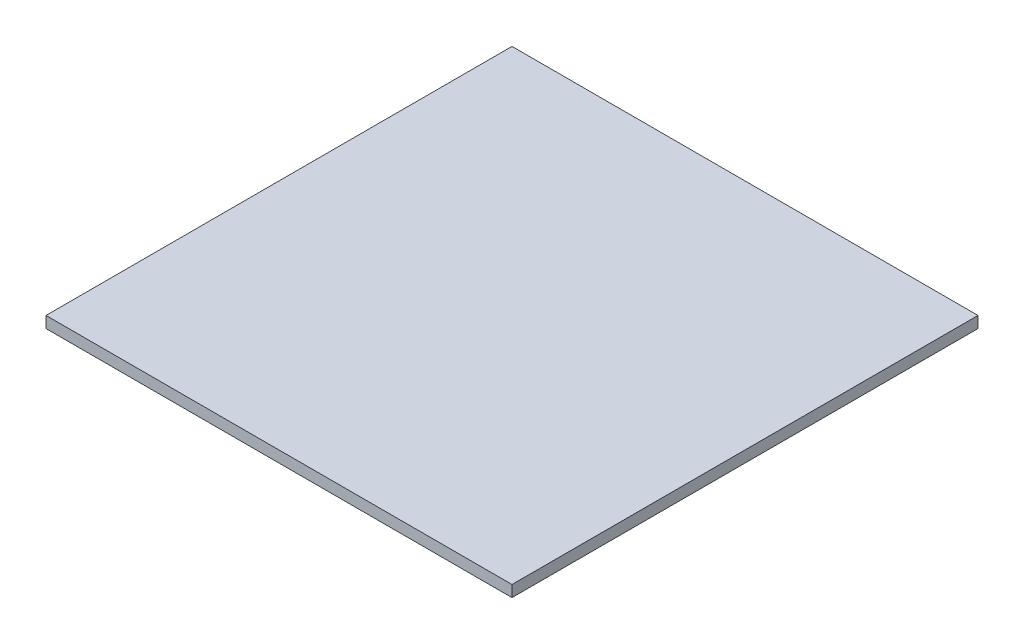
ISO-10303-21;
HEADER;
FILE_DESCRIPTION(('STEP AP214'),'2;1');
FILE_NAME('part.step','',(''),(''),'','','');
FILE_SCHEMA(('AUTOMOTIVE_DESIGN { 1 0 10303 214 1 1 1 1 }'));
ENDSEC;
DATA;
#1=APPLICATION_CONTEXT('core data for automotive mechanical design processes');
#2=APPLICATION_PROTOCOL_DEFINITION('international standard','automotive_design',2000,#1);
#3=PRODUCT_CONTEXT('',#1,'mechanical');
#4=PRODUCT('Part','Part','',(#3));
#5=PRODUCT_RELATED_PRODUCT_CATEGORY('part','',(#4));
#6=PRODUCT_DEFINITION_FORMATION('','',#4);
#7=PRODUCT_DEFINITION_CONTEXT('part definition',#1,'design');
#8=PRODUCT_DEFINITION('design','',#6,#7);
#9=PRODUCT_DEFINITION_SHAPE('','',#8);
#10=(LENGTH_UNIT() NAMED_UNIT(*) SI_UNIT(.MILLI.,.METRE.));
#11=(NAMED_UNIT(*) PLANE_ANGLE_UNIT() SI_UNIT($,.RADIAN.));
#12=(NAMED_UNIT(*) SI_UNIT($,.STERADIAN.) SOLID_ANGLE_UNIT());
#13=UNCERTAINTY_MEASURE_WITH_UNIT(LENGTH_MEASURE(1.E-05),#10,'distance_accuracy_value','');
#14=(GEOMETRIC_REPRESENTATION_CONTEXT(3) GLOBAL_UNCERTAINTY_ASSIGNED_CONTEXT((#13)) GLOBAL_UNIT_ASSIGNED_CONTEXT((#10,
#11,#12)) REPRESENTATION_CONTEXT('',''));
#15=CARTESIAN_POINT('',(0.,0.,0.));
#16=DIRECTION('',(0.,0.,1.));
#17=DIRECTION('',(1.,0.,0.));
#18=AXIS2_PLACEMENT_3D('',#15,#16,#17);
#19=CARTESIAN_POINT('',(520.7,25.4,-520.7));
#20=DIRECTION('',(-1.,0.,0.));
#21=DIRECTION('',(0.,0.,1.));
#22=AXIS2_PLACEMENT_3D('',#19,#20,#21);
#23=PLANE('',#22);
#24=DIRECTION('',(0.,0.,-1.));
#25=VECTOR('',#24,1.);
#26=CARTESIAN_POINT('',(520.7,0.,-520.7));
#27=LINE('',#26,#25);
#28=CARTESIAN_POINT('',(520.7,0.,520.7));
#29=VERTEX_POINT('',#28);
#30=CARTESIAN_POINT('',(520.7,0.,-520.7));
#31=VERTEX_POINT('',#30);
#32=EDGE_CURVE('E110',#29,#31,#27,.T.);
#33=ORIENTED_EDGE('',*,*,#32,.T.);
#34=DIRECTION('',(0.,-1.,0.));
#35=VECTOR('',#34,1.);
#36=CARTESIAN_POINT('',(520.7,25.4,-520.7));
#37=LINE('',#36,#35);
#38=CARTESIAN_POINT('',(520.7,25.4,-520.7));
#39=VERTEX_POINT('',#38);
#40=EDGE_CURVE('E11',#39,#31,#37,.T.);
#41=ORIENTED_EDGE('',*,*,#40,.F.);
#42=DIRECTION('',(0.,0.,-1.));
#43=VECTOR('',#42,1.);
#44=CARTESIAN_POINT('',(520.7,25.4,-520.7));
#45=LINE('',#44,#43);
#46=CARTESIAN_POINT('',(520.7,25.4,520.7));
#47=VERTEX_POINT('',#46);
#48=EDGE_CURVE('E98',#47,#39,#45,.T.);
#49=ORIENTED_EDGE('',*,*,#48,.F.);
#50=DIRECTION('',(0.,-1.,0.));
#51=VECTOR('',#50,1.);
#52=CARTESIAN_POINT('',(520.7,25.4,520.7));
#53=LINE('',#52,#51);
#54=EDGE_CURVE('E106',#47,#29,#53,.T.);
#55=ORIENTED_EDGE('',*,*,#54,.T.);
#56=EDGE_LOOP('',(#33,#41,#49,#55));
#57=FACE_BOUND('',#56,.T.);
#58=ADVANCED_FACE('F47',(#57),#23,.F.);
#59=CARTESIAN_POINT('',(-520.7,25.4,-520.7));
#60=DIRECTION('',(0.,0.,1.));
#61=DIRECTION('',(1.,0.,0.));
#62=AXIS2_PLACEMENT_3D('',#59,#60,#61);
#63=PLANE('',#62);
#64=DIRECTION('',(-1.,0.,0.));
#65=VECTOR('',#64,1.);
#66=CARTESIAN_POINT('',(-520.7,0.,-520.7));
#67=LINE('',#66,#65);
#68=CARTESIAN_POINT('',(-520.7,0.,-520.7));
#69=VERTEX_POINT('',#68);
#70=EDGE_CURVE('E102',#31,#69,#67,.T.);
#71=ORIENTED_EDGE('',*,*,#70,.T.);
#72=DIRECTION('',(0.,-1.,0.));
#73=VECTOR('',#72,1.);
#74=CARTESIAN_POINT('',(-520.7,25.4,-520.7));
#75=LINE('',#74,#73);
#76=CARTESIAN_POINT('',(-520.7,25.4,-520.7));
#77=VERTEX_POINT('',#76);
#78=EDGE_CURVE('E55',#77,#69,#75,.T.);
#79=ORIENTED_EDGE('',*,*,#78,.F.);
#80=DIRECTION('',(-1.,0.,0.));
#81=VECTOR('',#80,1.);
#82=CARTESIAN_POINT('',(-520.7,25.4,-520.7));
#83=LINE('',#82,#81);
#84=EDGE_CURVE('E93',#39,#77,#83,.T.);
#85=ORIENTED_EDGE('',*,*,#84,.F.);
#86=ORIENTED_EDGE('',*,*,#40,.T.);
#87=EDGE_LOOP('',(#71,#79,#85,#86));
#88=FACE_BOUND('',#87,.T.);
#89=ADVANCED_FACE('F101',(#88),#63,.F.);
#90=CARTESIAN_POINT('',(-520.7,25.4,-520.7));
#91=DIRECTION('',(1.,0.,0.));
#92=DIRECTION('',(0.,0.,-1.));
#93=AXIS2_PLACEMENT_3D('',#90,#91,#92);
#94=PLANE('',#93);
#95=DIRECTION('',(0.,0.,1.));
#96=VECTOR('',#95,1.);
#97=CARTESIAN_POINT('',(-520.7,0.,-520.7));
#98=LINE('',#97,#96);
#99=CARTESIAN_POINT('',(-520.7,0.,520.7));
#100=VERTEX_POINT('',#99);
#101=EDGE_CURVE('E80',#69,#100,#98,.T.);
#102=ORIENTED_EDGE('',*,*,#101,.T.);
#103=DIRECTION('',(0.,-1.,0.));
#104=VECTOR('',#103,1.);
#105=CARTESIAN_POINT('',(-520.7,25.4,520.7));
#106=LINE('',#105,#104);
#107=CARTESIAN_POINT('',(-520.7,25.4,520.7));
#108=VERTEX_POINT('',#107);
#109=EDGE_CURVE('E103',#108,#100,#106,.T.);
#110=ORIENTED_EDGE('',*,*,#109,.F.);
#111=DIRECTION('',(0.,0.,1.));
#112=VECTOR('',#111,1.);
#113=CARTESIAN_POINT('',(-520.7,25.4,-520.7));
#114=LINE('',#113,#112);
#115=EDGE_CURVE('E96',#77,#108,#114,.T.);
#116=ORIENTED_EDGE('',*,*,#115,.F.);
#117=ORIENTED_EDGE('',*,*,#78,.T.);
#118=EDGE_LOOP('',(#102,#110,#116,#117));
#119=FACE_BOUND('',#118,.T.);
#120=ADVANCED_FACE('F104',(#119),#94,.F.);
#121=CARTESIAN_POINT('',(-520.7,25.4,520.7));
#122=DIRECTION('',(0.,0.,-1.));
#123=DIRECTION('',(-1.,0.,0.));
#124=AXIS2_PLACEMENT_3D('',#121,#122,#123);
#125=PLANE('',#124);
#126=DIRECTION('',(1.,0.,0.));
#127=VECTOR('',#126,1.);
#128=CARTESIAN_POINT('',(-520.7,0.,520.7));
#129=LINE('',#128,#127);
#130=EDGE_CURVE('E86',#100,#29,#129,.T.);
#131=ORIENTED_EDGE('',*,*,#130,.T.);
#132=ORIENTED_EDGE('',*,*,#54,.F.);
#133=DIRECTION('',(1.,0.,0.));
#134=VECTOR('',#133,1.);
#135=CARTESIAN_POINT('',(-520.7,25.4,520.7));
#136=LINE('',#135,#134);
#137=EDGE_CURVE('E63',#108,#47,#136,.T.);
#138=ORIENTED_EDGE('',*,*,#137,.F.);
#139=ORIENTED_EDGE('',*,*,#109,.T.);
#140=EDGE_LOOP('',(#131,#132,#138,#139));
#141=FACE_BOUND('',#140,.T.);
#142=ADVANCED_FACE('F117',(#141),#125,.F.);
#143=CARTESIAN_POINT('',(0.,25.4,0.));
#144=DIRECTION('',(0.,1.,0.));
#145=DIRECTION('',(0.,0.,1.));
#146=AXIS2_PLACEMENT_3D('',#143,#144,#145);
#147=PLANE('',#146);
#148=ORIENTED_EDGE('',*,*,#48,.T.);
#149=ORIENTED_EDGE('',*,*,#84,.T.);
#150=ORIENTED_EDGE('',*,*,#115,.T.);
#151=ORIENTED_EDGE('',*,*,#137,.T.);
#152=EDGE_LOOP('',(#148,#149,#150,#151));
#153=FACE_BOUND('',#152,.T.);
#154=ADVANCED_FACE('F94',(#153),#147,.T.);
#155=CARTESIAN_POINT('',(0.,0.,0.));
#156=DIRECTION('',(0.,1.,0.));
#157=DIRECTION('',(0.,0.,1.));
#158=AXIS2_PLACEMENT_3D('',#155,#156,#157);
#159=PLANE('',#158);
#160=ORIENTED_EDGE('',*,*,#32,.F.);
#161=ORIENTED_EDGE('',*,*,#130,.F.);
#162=ORIENTED_EDGE('',*,*,#101,.F.);
#163=ORIENTED_EDGE('',*,*,#70,.F.);
#164=EDGE_LOOP('',(#160,#161,#162,#163));
#165=FACE_BOUND('',#164,.T.);
#166=ADVANCED_FACE('F120',(#165),#159,.F.);
#167=CLOSED_SHELL('',(#58,#89,#120,#142,#154,#166));
#168=MANIFOLD_SOLID_BREP('B2',#167);
#169=ADVANCED_BREP_SHAPE_REPRESENTATION('',(#18,#168),#14);
#170=SHAPE_DEFINITION_REPRESENTATION(#9,#169);
ENDSEC;
END-ISO-10303-21;
